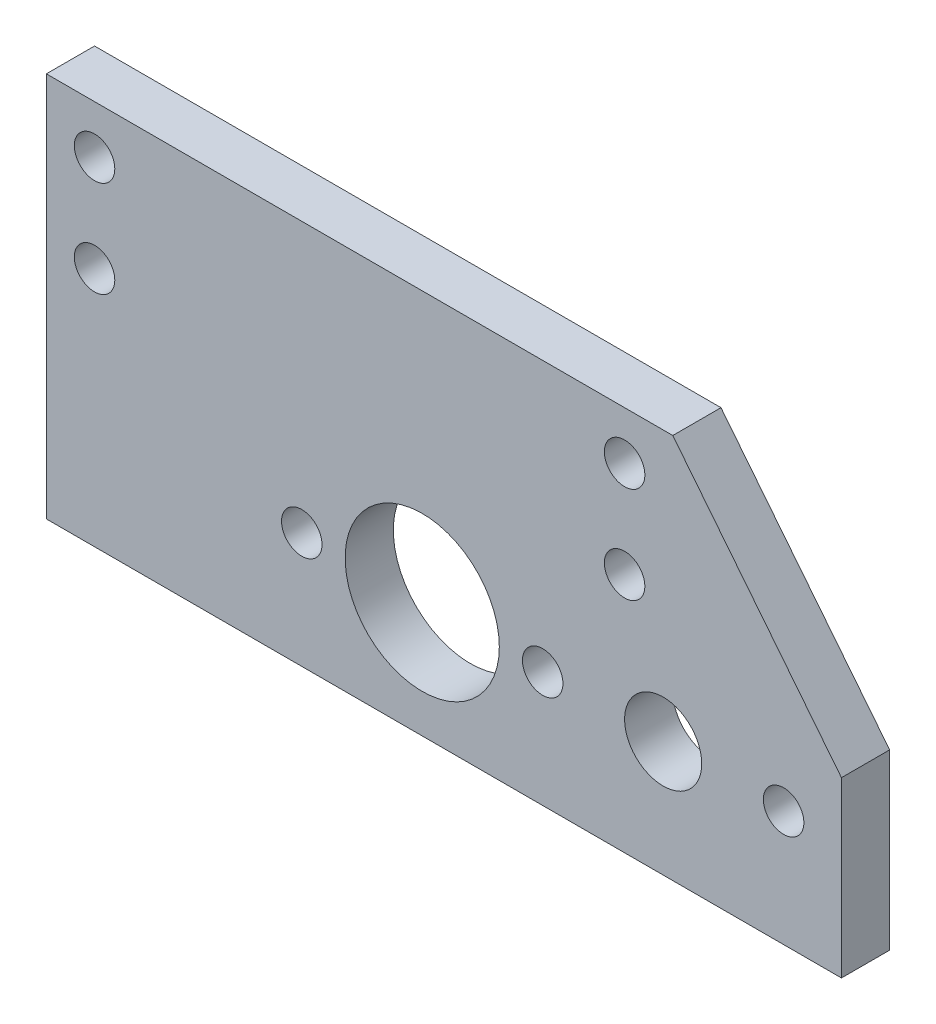
ISO-10303-21;
HEADER;
FILE_DESCRIPTION(('STEP AP214'),'2;1');
FILE_NAME('part.step','',(''),(''),'','','');
FILE_SCHEMA(('AUTOMOTIVE_DESIGN { 1 0 10303 214 1 1 1 1 }'));
ENDSEC;
DATA;
#1=APPLICATION_CONTEXT('core data for automotive mechanical design processes');
#2=APPLICATION_PROTOCOL_DEFINITION('international standard','automotive_design',2000,#1);
#3=PRODUCT_CONTEXT('',#1,'mechanical');
#4=PRODUCT('Part','Part','',(#3));
#5=PRODUCT_RELATED_PRODUCT_CATEGORY('part','',(#4));
#6=PRODUCT_DEFINITION_FORMATION('','',#4);
#7=PRODUCT_DEFINITION_CONTEXT('part definition',#1,'design');
#8=PRODUCT_DEFINITION('design','',#6,#7);
#9=PRODUCT_DEFINITION_SHAPE('','',#8);
#10=(LENGTH_UNIT() NAMED_UNIT(*) SI_UNIT(.MILLI.,.METRE.));
#11=(NAMED_UNIT(*) PLANE_ANGLE_UNIT() SI_UNIT($,.RADIAN.));
#12=(NAMED_UNIT(*) SI_UNIT($,.STERADIAN.) SOLID_ANGLE_UNIT());
#13=UNCERTAINTY_MEASURE_WITH_UNIT(LENGTH_MEASURE(1.E-05),#10,'distance_accuracy_value','');
#14=(GEOMETRIC_REPRESENTATION_CONTEXT(3) GLOBAL_UNCERTAINTY_ASSIGNED_CONTEXT((#13)) GLOBAL_UNIT_ASSIGNED_CONTEXT((#10,
#11,#12)) REPRESENTATION_CONTEXT('',''));
#15=CARTESIAN_POINT('',(0.,0.,0.));
#16=DIRECTION('',(0.,0.,1.));
#17=DIRECTION('',(1.,0.,0.));
#18=AXIS2_PLACEMENT_3D('',#15,#16,#17);
#19=CARTESIAN_POINT('',(0.,0.,5.));
#20=DIRECTION('',(0.,0.,1.));
#21=DIRECTION('',(1.,0.,0.));
#22=AXIS2_PLACEMENT_3D('',#19,#20,#21);
#23=PLANE('',#22);
#24=CARTESIAN_POINT('',(103.111470678347,-12.6614906832298,5.));
#25=DIRECTION('',(0.,0.,1.));
#26=DIRECTION('',(1.,0.,0.));
#27=AXIS2_PLACEMENT_3D('',#24,#25,#26);
#28=CIRCLE('',#27,2.1);
#29=CARTESIAN_POINT('',(105.211470678347,-12.6614906832298,5.));
#30=VERTEX_POINT('',#29);
#31=EDGE_CURVE('E297',#30,#30,#28,.T.);
#32=ORIENTED_EDGE('',*,*,#31,.F.);
#33=EDGE_LOOP('',(#32));
#34=FACE_BOUND('',#33,.T.);
#35=CARTESIAN_POINT('',(90.6114706783472,-12.6614906832298,5.));
#36=DIRECTION('',(0.,0.,1.));
#37=DIRECTION('',(1.,0.,0.));
#38=AXIS2_PLACEMENT_3D('',#35,#36,#37);
#39=CIRCLE('',#38,8.00000000000001);
#40=CARTESIAN_POINT('',(98.6114706783472,-12.6614906832298,5.));
#41=VERTEX_POINT('',#40);
#42=EDGE_CURVE('E309',#41,#41,#39,.T.);
#43=ORIENTED_EDGE('',*,*,#42,.F.);
#44=EDGE_LOOP('',(#43));
#45=FACE_BOUND('',#44,.T.);
#46=CARTESIAN_POINT('',(111.611470678347,0.338509316770208,5.));
#47=DIRECTION('',(0.,0.,1.));
#48=DIRECTION('',(1.,0.,0.));
#49=AXIS2_PLACEMENT_3D('',#46,#47,#48);
#50=CIRCLE('',#49,2.10000000000002);
#51=CARTESIAN_POINT('',(113.711470678347,0.338509316770208,5.));
#52=VERTEX_POINT('',#51);
#53=EDGE_CURVE('E321',#52,#52,#50,.T.);
#54=ORIENTED_EDGE('',*,*,#53,.F.);
#55=EDGE_LOOP('',(#54));
#56=FACE_BOUND('',#55,.T.);
#57=CARTESIAN_POINT('',(111.611470678347,10.3385093167702,5.));
#58=DIRECTION('',(0.,0.,1.));
#59=DIRECTION('',(1.,0.,0.));
#60=AXIS2_PLACEMENT_3D('',#57,#58,#59);
#61=CIRCLE('',#60,2.09999999999999);
#62=CARTESIAN_POINT('',(113.711470678347,10.3385093167702,5.));
#63=VERTEX_POINT('',#62);
#64=EDGE_CURVE('E333',#63,#63,#61,.T.);
#65=ORIENTED_EDGE('',*,*,#64,.F.);
#66=EDGE_LOOP('',(#65));
#67=FACE_BOUND('',#66,.T.);
#68=DIRECTION('',(0.,-1.,0.));
#69=VECTOR('',#68,1.);
#70=CARTESIAN_POINT('',(51.6114706783472,-6.6614906832298,5.));
#71=LINE('',#70,#69);
#72=CARTESIAN_POINT('',(51.6114706783472,15.3385093167702,5.));
#73=VERTEX_POINT('',#72);
#74=CARTESIAN_POINT('',(51.6114706783472,-24.6614906832298,5.));
#75=VERTEX_POINT('',#74);
#76=EDGE_CURVE('E54',#73,#75,#71,.T.);
#77=ORIENTED_EDGE('',*,*,#76,.T.);
#78=DIRECTION('',(1.,0.,0.));
#79=VECTOR('',#78,1.);
#80=CARTESIAN_POINT('',(51.6114706783472,-24.6614906832298,5.));
#81=LINE('',#80,#79);
#82=CARTESIAN_POINT('',(134.111470678347,-24.6614906832298,5.));
#83=VERTEX_POINT('',#82);
#84=EDGE_CURVE('E89',#75,#83,#81,.T.);
#85=ORIENTED_EDGE('',*,*,#84,.T.);
#86=DIRECTION('',(0.,1.,0.));
#87=VECTOR('',#86,1.);
#88=CARTESIAN_POINT('',(134.111470678347,-6.66149068322979,5.));
#89=LINE('',#88,#87);
#90=CARTESIAN_POINT('',(134.111470678347,-6.66149068322979,5.));
#91=VERTEX_POINT('',#90);
#92=EDGE_CURVE('E94',#83,#91,#89,.T.);
#93=ORIENTED_EDGE('',*,*,#92,.T.);
#94=DIRECTION('',(-0.622523565821539,0.782601054175649,0.));
#95=VECTOR('',#94,1.);
#96=CARTESIAN_POINT('',(116.611470678347,15.3385093167702,5.));
#97=LINE('',#96,#95);
#98=CARTESIAN_POINT('',(116.611470678347,15.3385093167702,5.));
#99=VERTEX_POINT('',#98);
#100=EDGE_CURVE('E98',#91,#99,#97,.T.);
#101=ORIENTED_EDGE('',*,*,#100,.T.);
#102=DIRECTION('',(-1.,0.,0.));
#103=VECTOR('',#102,1.);
#104=CARTESIAN_POINT('',(116.611470678347,15.3385093167702,5.));
#105=LINE('',#104,#103);
#106=EDGE_CURVE('E110',#99,#73,#105,.T.);
#107=ORIENTED_EDGE('',*,*,#106,.T.);
#108=EDGE_LOOP('',(#77,#85,#93,#101,#107));
#109=FACE_BOUND('',#108,.T.);
#110=CARTESIAN_POINT('',(56.6114706783472,10.3385093167702,5.));
#111=DIRECTION('',(0.,0.,1.));
#112=DIRECTION('',(1.,0.,0.));
#113=AXIS2_PLACEMENT_3D('',#110,#111,#112);
#114=CIRCLE('',#113,2.09999999999999);
#115=CARTESIAN_POINT('',(58.7114706783471,10.3385093167702,5.));
#116=VERTEX_POINT('',#115);
#117=EDGE_CURVE('E118',#116,#116,#114,.T.);
#118=ORIENTED_EDGE('',*,*,#117,.F.);
#119=EDGE_LOOP('',(#118));
#120=FACE_BOUND('',#119,.T.);
#121=CARTESIAN_POINT('',(56.6114706783472,0.338509316770203,5.));
#122=DIRECTION('',(0.,0.,1.));
#123=DIRECTION('',(1.,0.,0.));
#124=AXIS2_PLACEMENT_3D('',#121,#122,#123);
#125=CIRCLE('',#124,2.09999999999999);
#126=CARTESIAN_POINT('',(58.7114706783471,0.338509316770203,5.));
#127=VERTEX_POINT('',#126);
#128=EDGE_CURVE('E327',#127,#127,#125,.T.);
#129=ORIENTED_EDGE('',*,*,#128,.F.);
#130=EDGE_LOOP('',(#129));
#131=FACE_BOUND('',#130,.T.);
#132=CARTESIAN_POINT('',(115.611470678347,-12.6614906832298,5.));
#133=DIRECTION('',(0.,0.,1.));
#134=DIRECTION('',(1.,0.,0.));
#135=AXIS2_PLACEMENT_3D('',#132,#133,#134);
#136=CIRCLE('',#135,4.00000000000001);
#137=CARTESIAN_POINT('',(119.611470678347,-12.6614906832298,5.));
#138=VERTEX_POINT('',#137);
#139=EDGE_CURVE('E315',#138,#138,#136,.T.);
#140=ORIENTED_EDGE('',*,*,#139,.F.);
#141=EDGE_LOOP('',(#140));
#142=FACE_BOUND('',#141,.T.);
#143=CARTESIAN_POINT('',(78.1114706783472,-12.6614906832298,5.));
#144=DIRECTION('',(0.,0.,1.));
#145=DIRECTION('',(1.,0.,0.));
#146=AXIS2_PLACEMENT_3D('',#143,#144,#145);
#147=CIRCLE('',#146,2.1);
#148=CARTESIAN_POINT('',(80.2114706783472,-12.6614906832298,5.));
#149=VERTEX_POINT('',#148);
#150=EDGE_CURVE('E303',#149,#149,#147,.T.);
#151=ORIENTED_EDGE('',*,*,#150,.F.);
#152=EDGE_LOOP('',(#151));
#153=FACE_BOUND('',#152,.T.);
#154=CARTESIAN_POINT('',(128.111470678347,-12.6614906832298,5.));
#155=DIRECTION('',(0.,0.,1.));
#156=DIRECTION('',(1.,0.,0.));
#157=AXIS2_PLACEMENT_3D('',#154,#155,#156);
#158=CIRCLE('',#157,2.09999999999999);
#159=CARTESIAN_POINT('',(130.211470678347,-12.6614906832298,5.));
#160=VERTEX_POINT('',#159);
#161=EDGE_CURVE('E288',#160,#160,#158,.T.);
#162=ORIENTED_EDGE('',*,*,#161,.F.);
#163=EDGE_LOOP('',(#162));
#164=FACE_BOUND('',#163,.T.);
#165=ADVANCED_FACE('F37',(#34,#45,#56,#67,#109,#120,#131,#142,#153,#164),#23,.T.);
#166=CARTESIAN_POINT('',(0.,0.,0.));
#167=DIRECTION('',(0.,0.,1.));
#168=DIRECTION('',(1.,0.,0.));
#169=AXIS2_PLACEMENT_3D('',#166,#167,#168);
#170=PLANE('',#169);
#171=DIRECTION('',(1.,0.,0.));
#172=VECTOR('',#171,1.);
#173=CARTESIAN_POINT('',(134.111470678347,-24.6614906832298,0.));
#174=LINE('',#173,#172);
#175=CARTESIAN_POINT('',(51.6114706783472,-24.6614906832298,0.));
#176=VERTEX_POINT('',#175);
#177=CARTESIAN_POINT('',(134.111470678347,-24.6614906832298,0.));
#178=VERTEX_POINT('',#177);
#179=EDGE_CURVE('E116',#176,#178,#174,.T.);
#180=ORIENTED_EDGE('',*,*,#179,.F.);
#181=DIRECTION('',(0.,-1.,0.));
#182=VECTOR('',#181,1.);
#183=CARTESIAN_POINT('',(51.6114706783472,15.3385093167702,0.));
#184=LINE('',#183,#182);
#185=CARTESIAN_POINT('',(51.6114706783472,15.3385093167702,0.));
#186=VERTEX_POINT('',#185);
#187=EDGE_CURVE('E122',#186,#176,#184,.T.);
#188=ORIENTED_EDGE('',*,*,#187,.F.);
#189=DIRECTION('',(-1.,0.,0.));
#190=VECTOR('',#189,1.);
#191=CARTESIAN_POINT('',(116.611470678347,15.3385093167702,0.));
#192=LINE('',#191,#190);
#193=CARTESIAN_POINT('',(116.611470678347,15.3385093167702,0.));
#194=VERTEX_POINT('',#193);
#195=EDGE_CURVE('E82',#194,#186,#192,.T.);
#196=ORIENTED_EDGE('',*,*,#195,.F.);
#197=DIRECTION('',(-0.622523565821539,0.782601054175649,0.));
#198=VECTOR('',#197,1.);
#199=CARTESIAN_POINT('',(116.611470678347,15.3385093167702,0.));
#200=LINE('',#199,#198);
#201=CARTESIAN_POINT('',(134.111470678347,-6.66149068322979,0.));
#202=VERTEX_POINT('',#201);
#203=EDGE_CURVE('E75',#202,#194,#200,.T.);
#204=ORIENTED_EDGE('',*,*,#203,.F.);
#205=DIRECTION('',(0.,1.,0.));
#206=VECTOR('',#205,1.);
#207=CARTESIAN_POINT('',(134.111470678347,-6.66149068322979,0.));
#208=LINE('',#207,#206);
#209=EDGE_CURVE('E105',#178,#202,#208,.T.);
#210=ORIENTED_EDGE('',*,*,#209,.F.);
#211=EDGE_LOOP('',(#180,#188,#196,#204,#210));
#212=FACE_BOUND('',#211,.T.);
#213=CARTESIAN_POINT('',(56.6114706783472,10.3385093167702,0.));
#214=DIRECTION('',(0.,0.,1.));
#215=DIRECTION('',(1.,0.,0.));
#216=AXIS2_PLACEMENT_3D('',#213,#214,#215);
#217=CIRCLE('',#216,2.09999999999999);
#218=CARTESIAN_POINT('',(58.7114706783471,10.3385093167702,0.));
#219=VERTEX_POINT('',#218);
#220=EDGE_CURVE('E336',#219,#219,#217,.T.);
#221=ORIENTED_EDGE('',*,*,#220,.T.);
#222=EDGE_LOOP('',(#221));
#223=FACE_BOUND('',#222,.T.);
#224=CARTESIAN_POINT('',(111.611470678347,10.3385093167702,0.));
#225=DIRECTION('',(0.,0.,1.));
#226=DIRECTION('',(1.,0.,0.));
#227=AXIS2_PLACEMENT_3D('',#224,#225,#226);
#228=CIRCLE('',#227,2.09999999999999);
#229=CARTESIAN_POINT('',(113.711470678347,10.3385093167702,0.));
#230=VERTEX_POINT('',#229);
#231=EDGE_CURVE('E330',#230,#230,#228,.T.);
#232=ORIENTED_EDGE('',*,*,#231,.T.);
#233=EDGE_LOOP('',(#232));
#234=FACE_BOUND('',#233,.T.);
#235=CARTESIAN_POINT('',(56.6114706783472,0.338509316770203,0.));
#236=DIRECTION('',(0.,0.,1.));
#237=DIRECTION('',(1.,0.,0.));
#238=AXIS2_PLACEMENT_3D('',#235,#236,#237);
#239=CIRCLE('',#238,2.09999999999999);
#240=CARTESIAN_POINT('',(58.7114706783471,0.338509316770203,0.));
#241=VERTEX_POINT('',#240);
#242=EDGE_CURVE('E324',#241,#241,#239,.T.);
#243=ORIENTED_EDGE('',*,*,#242,.T.);
#244=EDGE_LOOP('',(#243));
#245=FACE_BOUND('',#244,.T.);
#246=CARTESIAN_POINT('',(111.611470678347,0.338509316770208,0.));
#247=DIRECTION('',(0.,0.,1.));
#248=DIRECTION('',(1.,0.,0.));
#249=AXIS2_PLACEMENT_3D('',#246,#247,#248);
#250=CIRCLE('',#249,2.10000000000002);
#251=CARTESIAN_POINT('',(113.711470678347,0.338509316770208,0.));
#252=VERTEX_POINT('',#251);
#253=EDGE_CURVE('E318',#252,#252,#250,.T.);
#254=ORIENTED_EDGE('',*,*,#253,.T.);
#255=EDGE_LOOP('',(#254));
#256=FACE_BOUND('',#255,.T.);
#257=CARTESIAN_POINT('',(115.611470678347,-12.6614906832298,0.));
#258=DIRECTION('',(0.,0.,1.));
#259=DIRECTION('',(1.,0.,0.));
#260=AXIS2_PLACEMENT_3D('',#257,#258,#259);
#261=CIRCLE('',#260,4.00000000000001);
#262=CARTESIAN_POINT('',(119.611470678347,-12.6614906832298,0.));
#263=VERTEX_POINT('',#262);
#264=EDGE_CURVE('E312',#263,#263,#261,.T.);
#265=ORIENTED_EDGE('',*,*,#264,.T.);
#266=EDGE_LOOP('',(#265));
#267=FACE_BOUND('',#266,.T.);
#268=CARTESIAN_POINT('',(90.6114706783472,-12.6614906832298,0.));
#269=DIRECTION('',(0.,0.,1.));
#270=DIRECTION('',(1.,0.,0.));
#271=AXIS2_PLACEMENT_3D('',#268,#269,#270);
#272=CIRCLE('',#271,8.00000000000001);
#273=CARTESIAN_POINT('',(98.6114706783472,-12.6614906832298,0.));
#274=VERTEX_POINT('',#273);
#275=EDGE_CURVE('E306',#274,#274,#272,.T.);
#276=ORIENTED_EDGE('',*,*,#275,.T.);
#277=EDGE_LOOP('',(#276));
#278=FACE_BOUND('',#277,.T.);
#279=CARTESIAN_POINT('',(78.1114706783472,-12.6614906832298,0.));
#280=DIRECTION('',(0.,0.,1.));
#281=DIRECTION('',(1.,0.,0.));
#282=AXIS2_PLACEMENT_3D('',#279,#280,#281);
#283=CIRCLE('',#282,2.1);
#284=CARTESIAN_POINT('',(80.2114706783472,-12.6614906832298,0.));
#285=VERTEX_POINT('',#284);
#286=EDGE_CURVE('E300',#285,#285,#283,.T.);
#287=ORIENTED_EDGE('',*,*,#286,.T.);
#288=EDGE_LOOP('',(#287));
#289=FACE_BOUND('',#288,.T.);
#290=CARTESIAN_POINT('',(103.111470678347,-12.6614906832298,0.));
#291=DIRECTION('',(0.,0.,1.));
#292=DIRECTION('',(1.,0.,0.));
#293=AXIS2_PLACEMENT_3D('',#290,#291,#292);
#294=CIRCLE('',#293,2.1);
#295=CARTESIAN_POINT('',(105.211470678347,-12.6614906832298,0.));
#296=VERTEX_POINT('',#295);
#297=EDGE_CURVE('E294',#296,#296,#294,.T.);
#298=ORIENTED_EDGE('',*,*,#297,.T.);
#299=EDGE_LOOP('',(#298));
#300=FACE_BOUND('',#299,.T.);
#301=CARTESIAN_POINT('',(128.111470678347,-12.6614906832298,0.));
#302=DIRECTION('',(0.,0.,1.));
#303=DIRECTION('',(1.,0.,0.));
#304=AXIS2_PLACEMENT_3D('',#301,#302,#303);
#305=CIRCLE('',#304,2.09999999999999);
#306=CARTESIAN_POINT('',(130.211470678347,-12.6614906832298,0.));
#307=VERTEX_POINT('',#306);
#308=EDGE_CURVE('E291',#307,#307,#305,.T.);
#309=ORIENTED_EDGE('',*,*,#308,.T.);
#310=EDGE_LOOP('',(#309));
#311=FACE_BOUND('',#310,.T.);
#312=ADVANCED_FACE('F127',(#212,#223,#234,#245,#256,#267,#278,#289,#300,#311),#170,.F.);
#313=CARTESIAN_POINT('',(134.111470678347,-24.6614906832298,5.));
#314=DIRECTION('',(0.,1.,0.));
#315=DIRECTION('',(-1.,0.,0.));
#316=AXIS2_PLACEMENT_3D('',#313,#314,#315);
#317=PLANE('',#316);
#318=ORIENTED_EDGE('',*,*,#179,.T.);
#319=DIRECTION('',(0.,0.,-1.));
#320=VECTOR('',#319,1.);
#321=CARTESIAN_POINT('',(134.111470678347,-24.6614906832298,5.));
#322=LINE('',#321,#320);
#323=EDGE_CURVE('E46',#83,#178,#322,.T.);
#324=ORIENTED_EDGE('',*,*,#323,.F.);
#325=ORIENTED_EDGE('',*,*,#84,.F.);
#326=DIRECTION('',(0.,0.,-1.));
#327=VECTOR('',#326,1.);
#328=CARTESIAN_POINT('',(51.6114706783472,-24.6614906832298,5.));
#329=LINE('',#328,#327);
#330=EDGE_CURVE('E11',#75,#176,#329,.T.);
#331=ORIENTED_EDGE('',*,*,#330,.T.);
#332=EDGE_LOOP('',(#318,#324,#325,#331));
#333=FACE_BOUND('',#332,.T.);
#334=ADVANCED_FACE('F39',(#333),#317,.F.);
#335=CARTESIAN_POINT('',(134.111470678347,-6.66149068322979,5.));
#336=DIRECTION('',(-1.,0.,0.));
#337=DIRECTION('',(0.,0.,1.));
#338=AXIS2_PLACEMENT_3D('',#335,#336,#337);
#339=PLANE('',#338);
#340=ORIENTED_EDGE('',*,*,#209,.T.);
#341=DIRECTION('',(0.,0.,-1.));
#342=VECTOR('',#341,1.);
#343=CARTESIAN_POINT('',(134.111470678347,-6.66149068322979,5.));
#344=LINE('',#343,#342);
#345=EDGE_CURVE('E102',#91,#202,#344,.T.);
#346=ORIENTED_EDGE('',*,*,#345,.F.);
#347=ORIENTED_EDGE('',*,*,#92,.F.);
#348=ORIENTED_EDGE('',*,*,#323,.T.);
#349=EDGE_LOOP('',(#340,#346,#347,#348));
#350=FACE_BOUND('',#349,.T.);
#351=ADVANCED_FACE('F103',(#350),#339,.F.);
#352=CARTESIAN_POINT('',(116.611470678347,15.3385093167702,5.));
#353=DIRECTION('',(-0.782601054175649,-0.622523565821539,0.));
#354=DIRECTION('',(0.622523565821539,-0.782601054175649,0.));
#355=AXIS2_PLACEMENT_3D('',#352,#353,#354);
#356=PLANE('',#355);
#357=ORIENTED_EDGE('',*,*,#203,.T.);
#358=DIRECTION('',(0.,0.,-1.));
#359=VECTOR('',#358,1.);
#360=CARTESIAN_POINT('',(116.611470678347,15.3385093167702,5.));
#361=LINE('',#360,#359);
#362=EDGE_CURVE('E106',#99,#194,#361,.T.);
#363=ORIENTED_EDGE('',*,*,#362,.F.);
#364=ORIENTED_EDGE('',*,*,#100,.F.);
#365=ORIENTED_EDGE('',*,*,#345,.T.);
#366=EDGE_LOOP('',(#357,#363,#364,#365));
#367=FACE_BOUND('',#366,.T.);
#368=ADVANCED_FACE('F108',(#367),#356,.F.);
#369=CARTESIAN_POINT('',(116.611470678347,15.3385093167702,5.));
#370=DIRECTION('',(0.,-1.,0.));
#371=DIRECTION('',(1.,0.,0.));
#372=AXIS2_PLACEMENT_3D('',#369,#370,#371);
#373=PLANE('',#372);
#374=ORIENTED_EDGE('',*,*,#195,.T.);
#375=DIRECTION('',(0.,0.,-1.));
#376=VECTOR('',#375,1.);
#377=CARTESIAN_POINT('',(51.6114706783472,15.3385093167702,5.));
#378=LINE('',#377,#376);
#379=EDGE_CURVE('E112',#73,#186,#378,.T.);
#380=ORIENTED_EDGE('',*,*,#379,.F.);
#381=ORIENTED_EDGE('',*,*,#106,.F.);
#382=ORIENTED_EDGE('',*,*,#362,.T.);
#383=EDGE_LOOP('',(#374,#380,#381,#382));
#384=FACE_BOUND('',#383,.T.);
#385=ADVANCED_FACE('F150',(#384),#373,.F.);
#386=CARTESIAN_POINT('',(51.6114706783472,15.3385093167702,5.));
#387=DIRECTION('',(1.,0.,0.));
#388=DIRECTION('',(0.,0.,-1.));
#389=AXIS2_PLACEMENT_3D('',#386,#387,#388);
#390=PLANE('',#389);
#391=ORIENTED_EDGE('',*,*,#187,.T.);
#392=ORIENTED_EDGE('',*,*,#330,.F.);
#393=ORIENTED_EDGE('',*,*,#76,.F.);
#394=ORIENTED_EDGE('',*,*,#379,.T.);
#395=EDGE_LOOP('',(#391,#392,#393,#394));
#396=FACE_BOUND('',#395,.T.);
#397=ADVANCED_FACE('F130',(#396),#390,.F.);
#398=CARTESIAN_POINT('',(56.6114706783472,10.3385093167702,5.));
#399=DIRECTION('',(0.,0.,-1.));
#400=DIRECTION('',(-1.,0.,0.));
#401=AXIS2_PLACEMENT_3D('',#398,#399,#400);
#402=CYLINDRICAL_SURFACE('',#401,2.09999999999999);
#403=ORIENTED_EDGE('',*,*,#117,.T.);
#404=EDGE_LOOP('',(#403));
#405=FACE_BOUND('',#404,.T.);
#406=ORIENTED_EDGE('',*,*,#220,.F.);
#407=EDGE_LOOP('',(#406));
#408=FACE_BOUND('',#407,.T.);
#409=ADVANCED_FACE('F145',(#405,#408),#402,.F.);
#410=CARTESIAN_POINT('',(111.611470678347,10.3385093167702,5.));
#411=DIRECTION('',(0.,0.,-1.));
#412=DIRECTION('',(-1.,0.,0.));
#413=AXIS2_PLACEMENT_3D('',#410,#411,#412);
#414=CYLINDRICAL_SURFACE('',#413,2.09999999999999);
#415=ORIENTED_EDGE('',*,*,#64,.T.);
#416=EDGE_LOOP('',(#415));
#417=FACE_BOUND('',#416,.T.);
#418=ORIENTED_EDGE('',*,*,#231,.F.);
#419=EDGE_LOOP('',(#418));
#420=FACE_BOUND('',#419,.T.);
#421=ADVANCED_FACE('F172',(#417,#420),#414,.F.);
#422=CARTESIAN_POINT('',(56.6114706783472,0.338509316770203,5.));
#423=DIRECTION('',(0.,0.,-1.));
#424=DIRECTION('',(-1.,0.,0.));
#425=AXIS2_PLACEMENT_3D('',#422,#423,#424);
#426=CYLINDRICAL_SURFACE('',#425,2.09999999999999);
#427=ORIENTED_EDGE('',*,*,#128,.T.);
#428=EDGE_LOOP('',(#427));
#429=FACE_BOUND('',#428,.T.);
#430=ORIENTED_EDGE('',*,*,#242,.F.);
#431=EDGE_LOOP('',(#430));
#432=FACE_BOUND('',#431,.T.);
#433=ADVANCED_FACE('F179',(#429,#432),#426,.F.);
#434=CARTESIAN_POINT('',(111.611470678347,0.338509316770208,5.));
#435=DIRECTION('',(0.,0.,-1.));
#436=DIRECTION('',(-1.,0.,0.));
#437=AXIS2_PLACEMENT_3D('',#434,#435,#436);
#438=CYLINDRICAL_SURFACE('',#437,2.10000000000002);
#439=ORIENTED_EDGE('',*,*,#53,.T.);
#440=EDGE_LOOP('',(#439));
#441=FACE_BOUND('',#440,.T.);
#442=ORIENTED_EDGE('',*,*,#253,.F.);
#443=EDGE_LOOP('',(#442));
#444=FACE_BOUND('',#443,.T.);
#445=ADVANCED_FACE('F186',(#441,#444),#438,.F.);
#446=CARTESIAN_POINT('',(115.611470678347,-12.6614906832298,5.));
#447=DIRECTION('',(0.,0.,-1.));
#448=DIRECTION('',(-1.,0.,0.));
#449=AXIS2_PLACEMENT_3D('',#446,#447,#448);
#450=CYLINDRICAL_SURFACE('',#449,4.00000000000001);
#451=ORIENTED_EDGE('',*,*,#139,.T.);
#452=EDGE_LOOP('',(#451));
#453=FACE_BOUND('',#452,.T.);
#454=ORIENTED_EDGE('',*,*,#264,.F.);
#455=EDGE_LOOP('',(#454));
#456=FACE_BOUND('',#455,.T.);
#457=ADVANCED_FACE('F194',(#453,#456),#450,.F.);
#458=CARTESIAN_POINT('',(90.6114706783472,-12.6614906832298,5.));
#459=DIRECTION('',(0.,0.,-1.));
#460=DIRECTION('',(-1.,0.,0.));
#461=AXIS2_PLACEMENT_3D('',#458,#459,#460);
#462=CYLINDRICAL_SURFACE('',#461,8.00000000000001);
#463=ORIENTED_EDGE('',*,*,#42,.T.);
#464=EDGE_LOOP('',(#463));
#465=FACE_BOUND('',#464,.T.);
#466=ORIENTED_EDGE('',*,*,#275,.F.);
#467=EDGE_LOOP('',(#466));
#468=FACE_BOUND('',#467,.T.);
#469=ADVANCED_FACE('F202',(#465,#468),#462,.F.);
#470=CARTESIAN_POINT('',(78.1114706783472,-12.6614906832298,5.));
#471=DIRECTION('',(0.,0.,-1.));
#472=DIRECTION('',(-1.,0.,0.));
#473=AXIS2_PLACEMENT_3D('',#470,#471,#472);
#474=CYLINDRICAL_SURFACE('',#473,2.1);
#475=ORIENTED_EDGE('',*,*,#150,.T.);
#476=EDGE_LOOP('',(#475));
#477=FACE_BOUND('',#476,.T.);
#478=ORIENTED_EDGE('',*,*,#286,.F.);
#479=EDGE_LOOP('',(#478));
#480=FACE_BOUND('',#479,.T.);
#481=ADVANCED_FACE('F210',(#477,#480),#474,.F.);
#482=CARTESIAN_POINT('',(103.111470678347,-12.6614906832298,5.));
#483=DIRECTION('',(0.,0.,-1.));
#484=DIRECTION('',(-1.,0.,0.));
#485=AXIS2_PLACEMENT_3D('',#482,#483,#484);
#486=CYLINDRICAL_SURFACE('',#485,2.1);
#487=ORIENTED_EDGE('',*,*,#31,.T.);
#488=EDGE_LOOP('',(#487));
#489=FACE_BOUND('',#488,.T.);
#490=ORIENTED_EDGE('',*,*,#297,.F.);
#491=EDGE_LOOP('',(#490));
#492=FACE_BOUND('',#491,.T.);
#493=ADVANCED_FACE('F218',(#489,#492),#486,.F.);
#494=CARTESIAN_POINT('',(128.111470678347,-12.6614906832298,5.));
#495=DIRECTION('',(0.,0.,-1.));
#496=DIRECTION('',(-1.,0.,0.));
#497=AXIS2_PLACEMENT_3D('',#494,#495,#496);
#498=CYLINDRICAL_SURFACE('',#497,2.09999999999999);
#499=ORIENTED_EDGE('',*,*,#161,.T.);
#500=EDGE_LOOP('',(#499));
#501=FACE_BOUND('',#500,.T.);
#502=ORIENTED_EDGE('',*,*,#308,.F.);
#503=EDGE_LOOP('',(#502));
#504=FACE_BOUND('',#503,.T.);
#505=ADVANCED_FACE('F226',(#501,#504),#498,.F.);
#506=CLOSED_SHELL('',(#165,#312,#334,#351,#368,#385,#397,#409,#421,#433,#445,#457,#469,#481,
#493,#505));
#507=MANIFOLD_SOLID_BREP('B2',#506);
#508=ADVANCED_BREP_SHAPE_REPRESENTATION('',(#18,#507),#14);
#509=SHAPE_DEFINITION_REPRESENTATION(#9,#508);
ENDSEC;
END-ISO-10303-21;
